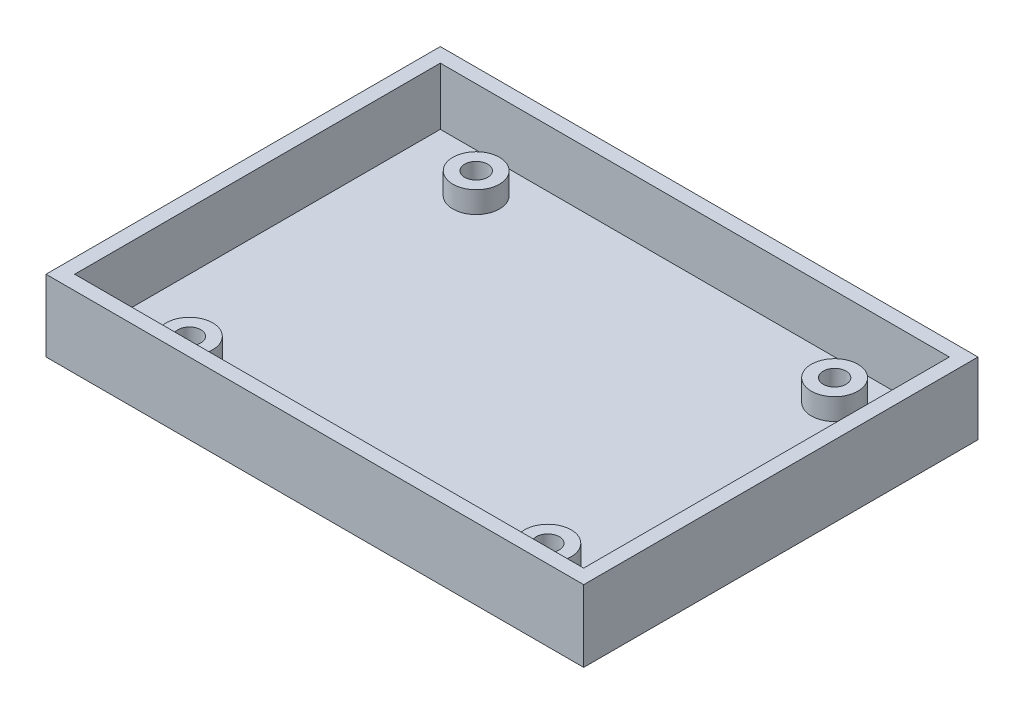
ISO-10303-21;
HEADER;
FILE_DESCRIPTION(('STEP AP214'),'2;1');
FILE_NAME('part.step','',(''),(''),'','','');
FILE_SCHEMA(('AUTOMOTIVE_DESIGN { 1 0 10303 214 1 1 1 1 }'));
ENDSEC;
DATA;
#1=APPLICATION_CONTEXT('core data for automotive mechanical design processes');
#2=APPLICATION_PROTOCOL_DEFINITION('international standard','automotive_design',2000,#1);
#3=PRODUCT_CONTEXT('',#1,'mechanical');
#4=PRODUCT('Part','Part','',(#3));
#5=PRODUCT_RELATED_PRODUCT_CATEGORY('part','',(#4));
#6=PRODUCT_DEFINITION_FORMATION('','',#4);
#7=PRODUCT_DEFINITION_CONTEXT('part definition',#1,'design');
#8=PRODUCT_DEFINITION('design','',#6,#7);
#9=PRODUCT_DEFINITION_SHAPE('','',#8);
#10=(LENGTH_UNIT() NAMED_UNIT(*) SI_UNIT(.MILLI.,.METRE.));
#11=(NAMED_UNIT(*) PLANE_ANGLE_UNIT() SI_UNIT($,.RADIAN.));
#12=(NAMED_UNIT(*) SI_UNIT($,.STERADIAN.) SOLID_ANGLE_UNIT());
#13=UNCERTAINTY_MEASURE_WITH_UNIT(LENGTH_MEASURE(1.E-05),#10,'distance_accuracy_value','');
#14=(GEOMETRIC_REPRESENTATION_CONTEXT(3) GLOBAL_UNCERTAINTY_ASSIGNED_CONTEXT((#13)) GLOBAL_UNIT_ASSIGNED_CONTEXT((#10,
#11,#12)) REPRESENTATION_CONTEXT('',''));
#15=CARTESIAN_POINT('',(0.,0.,0.));
#16=DIRECTION('',(0.,0.,1.));
#17=DIRECTION('',(1.,0.,0.));
#18=AXIS2_PLACEMENT_3D('',#15,#16,#17);
#19=CARTESIAN_POINT('',(-37.5,10.,27.5));
#20=DIRECTION('',(1.,0.,0.));
#21=DIRECTION('',(0.,0.,-1.));
#22=AXIS2_PLACEMENT_3D('',#19,#20,#21);
#23=PLANE('',#22);
#24=DIRECTION('',(0.,0.,1.));
#25=VECTOR('',#24,1.);
#26=CARTESIAN_POINT('',(-37.5,0.,27.5));
#27=LINE('',#26,#25);
#28=CARTESIAN_POINT('',(-37.5,0.,-27.5));
#29=VERTEX_POINT('',#28);
#30=CARTESIAN_POINT('',(-37.5,0.,27.5));
#31=VERTEX_POINT('',#30);
#32=EDGE_CURVE('E147',#29,#31,#27,.T.);
#33=ORIENTED_EDGE('',*,*,#32,.T.);
#34=DIRECTION('',(0.,-1.,0.));
#35=VECTOR('',#34,1.);
#36=CARTESIAN_POINT('',(-37.5,10.,27.5));
#37=LINE('',#36,#35);
#38=CARTESIAN_POINT('',(-37.5,10.,27.5));
#39=VERTEX_POINT('',#38);
#40=EDGE_CURVE('E11',#39,#31,#37,.T.);
#41=ORIENTED_EDGE('',*,*,#40,.F.);
#42=DIRECTION('',(0.,0.,1.));
#43=VECTOR('',#42,1.);
#44=CARTESIAN_POINT('',(-37.5,10.,27.5));
#45=LINE('',#44,#43);
#46=CARTESIAN_POINT('',(-37.5,10.,-27.5));
#47=VERTEX_POINT('',#46);
#48=EDGE_CURVE('E140',#47,#39,#45,.T.);
#49=ORIENTED_EDGE('',*,*,#48,.F.);
#50=DIRECTION('',(0.,-1.,0.));
#51=VECTOR('',#50,1.);
#52=CARTESIAN_POINT('',(-37.5,10.,-27.5));
#53=LINE('',#52,#51);
#54=EDGE_CURVE('E146',#47,#29,#53,.T.);
#55=ORIENTED_EDGE('',*,*,#54,.T.);
#56=EDGE_LOOP('',(#33,#41,#49,#55));
#57=FACE_BOUND('',#56,.T.);
#58=ADVANCED_FACE('F33',(#57),#23,.F.);
#59=CARTESIAN_POINT('',(37.5,10.,27.5));
#60=DIRECTION('',(0.,0.,-1.));
#61=DIRECTION('',(-1.,0.,0.));
#62=AXIS2_PLACEMENT_3D('',#59,#60,#61);
#63=PLANE('',#62);
#64=DIRECTION('',(1.,0.,0.));
#65=VECTOR('',#64,1.);
#66=CARTESIAN_POINT('',(37.5,0.,27.5));
#67=LINE('',#66,#65);
#68=CARTESIAN_POINT('',(37.5,0.,27.5));
#69=VERTEX_POINT('',#68);
#70=EDGE_CURVE('E150',#31,#69,#67,.T.);
#71=ORIENTED_EDGE('',*,*,#70,.T.);
#72=DIRECTION('',(0.,-1.,0.));
#73=VECTOR('',#72,1.);
#74=CARTESIAN_POINT('',(37.5,10.,27.5));
#75=LINE('',#74,#73);
#76=CARTESIAN_POINT('',(37.5,10.,27.5));
#77=VERTEX_POINT('',#76);
#78=EDGE_CURVE('E40',#77,#69,#75,.T.);
#79=ORIENTED_EDGE('',*,*,#78,.F.);
#80=DIRECTION('',(1.,0.,0.));
#81=VECTOR('',#80,1.);
#82=CARTESIAN_POINT('',(37.5,10.,27.5));
#83=LINE('',#82,#81);
#84=EDGE_CURVE('E84',#39,#77,#83,.T.);
#85=ORIENTED_EDGE('',*,*,#84,.F.);
#86=ORIENTED_EDGE('',*,*,#40,.T.);
#87=EDGE_LOOP('',(#71,#79,#85,#86));
#88=FACE_BOUND('',#87,.T.);
#89=ADVANCED_FACE('F179',(#88),#63,.F.);
#90=CARTESIAN_POINT('',(37.5,10.,27.5));
#91=DIRECTION('',(-1.,0.,0.));
#92=DIRECTION('',(0.,0.,1.));
#93=AXIS2_PLACEMENT_3D('',#90,#91,#92);
#94=PLANE('',#93);
#95=DIRECTION('',(0.,0.,-1.));
#96=VECTOR('',#95,1.);
#97=CARTESIAN_POINT('',(37.5,0.,27.5));
#98=LINE('',#97,#96);
#99=CARTESIAN_POINT('',(37.5,0.,-27.5));
#100=VERTEX_POINT('',#99);
#101=EDGE_CURVE('E152',#69,#100,#98,.T.);
#102=ORIENTED_EDGE('',*,*,#101,.T.);
#103=DIRECTION('',(0.,-1.,0.));
#104=VECTOR('',#103,1.);
#105=CARTESIAN_POINT('',(37.5,10.,-27.5));
#106=LINE('',#105,#104);
#107=CARTESIAN_POINT('',(37.5,10.,-27.5));
#108=VERTEX_POINT('',#107);
#109=EDGE_CURVE('E156',#108,#100,#106,.T.);
#110=ORIENTED_EDGE('',*,*,#109,.F.);
#111=DIRECTION('',(0.,0.,-1.));
#112=VECTOR('',#111,1.);
#113=CARTESIAN_POINT('',(37.5,10.,27.5));
#114=LINE('',#113,#112);
#115=EDGE_CURVE('E143',#77,#108,#114,.T.);
#116=ORIENTED_EDGE('',*,*,#115,.F.);
#117=ORIENTED_EDGE('',*,*,#78,.T.);
#118=EDGE_LOOP('',(#102,#110,#116,#117));
#119=FACE_BOUND('',#118,.T.);
#120=ADVANCED_FACE('F161',(#119),#94,.F.);
#121=CARTESIAN_POINT('',(37.5,10.,-27.5));
#122=DIRECTION('',(0.,0.,1.));
#123=DIRECTION('',(1.,0.,0.));
#124=AXIS2_PLACEMENT_3D('',#121,#122,#123);
#125=PLANE('',#124);
#126=DIRECTION('',(-1.,0.,0.));
#127=VECTOR('',#126,1.);
#128=CARTESIAN_POINT('',(37.5,0.,-27.5));
#129=LINE('',#128,#127);
#130=EDGE_CURVE('E77',#100,#29,#129,.T.);
#131=ORIENTED_EDGE('',*,*,#130,.T.);
#132=ORIENTED_EDGE('',*,*,#54,.F.);
#133=DIRECTION('',(-1.,0.,0.));
#134=VECTOR('',#133,1.);
#135=CARTESIAN_POINT('',(37.5,10.,-27.5));
#136=LINE('',#135,#134);
#137=EDGE_CURVE('E56',#108,#47,#136,.T.);
#138=ORIENTED_EDGE('',*,*,#137,.F.);
#139=ORIENTED_EDGE('',*,*,#109,.T.);
#140=EDGE_LOOP('',(#131,#132,#138,#139));
#141=FACE_BOUND('',#140,.T.);
#142=ADVANCED_FACE('F169',(#141),#125,.F.);
#143=CARTESIAN_POINT('',(0.,10.,0.));
#144=DIRECTION('',(0.,1.,0.));
#145=DIRECTION('',(0.,0.,1.));
#146=AXIS2_PLACEMENT_3D('',#143,#144,#145);
#147=PLANE('',#146);
#148=DIRECTION('',(0.,0.,1.));
#149=VECTOR('',#148,1.);
#150=CARTESIAN_POINT('',(-35.5,10.,27.5));
#151=LINE('',#150,#149);
#152=CARTESIAN_POINT('',(-35.5,10.,-25.5));
#153=VERTEX_POINT('',#152);
#154=CARTESIAN_POINT('',(-35.5,10.,25.5));
#155=VERTEX_POINT('',#154);
#156=EDGE_CURVE('E129',#153,#155,#151,.T.);
#157=ORIENTED_EDGE('',*,*,#156,.F.);
#158=DIRECTION('',(-1.,0.,0.));
#159=VECTOR('',#158,1.);
#160=CARTESIAN_POINT('',(37.5,10.,-25.5));
#161=LINE('',#160,#159);
#162=CARTESIAN_POINT('',(35.5,10.,-25.5));
#163=VERTEX_POINT('',#162);
#164=EDGE_CURVE('E138',#163,#153,#161,.T.);
#165=ORIENTED_EDGE('',*,*,#164,.F.);
#166=DIRECTION('',(0.,0.,-1.));
#167=VECTOR('',#166,1.);
#168=CARTESIAN_POINT('',(35.5,10.,27.5));
#169=LINE('',#168,#167);
#170=CARTESIAN_POINT('',(35.5,10.,25.5));
#171=VERTEX_POINT('',#170);
#172=EDGE_CURVE('E136',#171,#163,#169,.T.);
#173=ORIENTED_EDGE('',*,*,#172,.F.);
#174=DIRECTION('',(1.,0.,0.));
#175=VECTOR('',#174,1.);
#176=CARTESIAN_POINT('',(37.5,10.,25.5));
#177=LINE('',#176,#175);
#178=EDGE_CURVE('E121',#155,#171,#177,.T.);
#179=ORIENTED_EDGE('',*,*,#178,.F.);
#180=EDGE_LOOP('',(#157,#165,#173,#179));
#181=FACE_BOUND('',#180,.T.);
#182=ORIENTED_EDGE('',*,*,#48,.T.);
#183=ORIENTED_EDGE('',*,*,#84,.T.);
#184=ORIENTED_EDGE('',*,*,#115,.T.);
#185=ORIENTED_EDGE('',*,*,#137,.T.);
#186=EDGE_LOOP('',(#182,#183,#184,#185));
#187=FACE_BOUND('',#186,.T.);
#188=ADVANCED_FACE('F171',(#181,#187),#147,.T.);
#189=CARTESIAN_POINT('',(0.,0.,0.));
#190=DIRECTION('',(0.,1.,0.));
#191=DIRECTION('',(0.,0.,1.));
#192=AXIS2_PLACEMENT_3D('',#189,#190,#191);
#193=PLANE('',#192);
#194=ORIENTED_EDGE('',*,*,#32,.F.);
#195=ORIENTED_EDGE('',*,*,#130,.F.);
#196=ORIENTED_EDGE('',*,*,#101,.F.);
#197=ORIENTED_EDGE('',*,*,#70,.F.);
#198=EDGE_LOOP('',(#194,#195,#196,#197));
#199=FACE_BOUND('',#198,.T.);
#200=ADVANCED_FACE('F165',(#199),#193,.F.);
#201=CARTESIAN_POINT('',(-35.5,10.,27.5));
#202=DIRECTION('',(1.,0.,0.));
#203=DIRECTION('',(0.,0.,-1.));
#204=AXIS2_PLACEMENT_3D('',#201,#202,#203);
#205=PLANE('',#204);
#206=DIRECTION('',(0.,0.,1.));
#207=VECTOR('',#206,1.);
#208=CARTESIAN_POINT('',(-35.5,2.,27.5));
#209=LINE('',#208,#207);
#210=CARTESIAN_POINT('',(-35.5,2.,-25.5));
#211=VERTEX_POINT('',#210);
#212=CARTESIAN_POINT('',(-35.5,2.,25.5));
#213=VERTEX_POINT('',#212);
#214=EDGE_CURVE('E112',#211,#213,#209,.T.);
#215=ORIENTED_EDGE('',*,*,#214,.F.);
#216=DIRECTION('',(0.,-1.,0.));
#217=VECTOR('',#216,1.);
#218=CARTESIAN_POINT('',(-35.5,10.,-25.5));
#219=LINE('',#218,#217);
#220=EDGE_CURVE('E132',#153,#211,#219,.T.);
#221=ORIENTED_EDGE('',*,*,#220,.F.);
#222=ORIENTED_EDGE('',*,*,#156,.T.);
#223=DIRECTION('',(0.,-1.,0.));
#224=VECTOR('',#223,1.);
#225=CARTESIAN_POINT('',(-35.5,10.,25.5));
#226=LINE('',#225,#224);
#227=EDGE_CURVE('E124',#155,#213,#226,.T.);
#228=ORIENTED_EDGE('',*,*,#227,.T.);
#229=EDGE_LOOP('',(#215,#221,#222,#228));
#230=FACE_BOUND('',#229,.T.);
#231=ADVANCED_FACE('F206',(#230),#205,.T.);
#232=CARTESIAN_POINT('',(37.5,10.,25.5));
#233=DIRECTION('',(0.,0.,-1.));
#234=DIRECTION('',(-1.,0.,0.));
#235=AXIS2_PLACEMENT_3D('',#232,#233,#234);
#236=PLANE('',#235);
#237=DIRECTION('',(1.,0.,0.));
#238=VECTOR('',#237,1.);
#239=CARTESIAN_POINT('',(37.5,2.,25.5));
#240=LINE('',#239,#238);
#241=CARTESIAN_POINT('',(35.5,2.,25.5));
#242=VERTEX_POINT('',#241);
#243=EDGE_CURVE('E106',#213,#242,#240,.T.);
#244=ORIENTED_EDGE('',*,*,#243,.F.);
#245=ORIENTED_EDGE('',*,*,#227,.F.);
#246=ORIENTED_EDGE('',*,*,#178,.T.);
#247=DIRECTION('',(0.,-1.,0.));
#248=VECTOR('',#247,1.);
#249=CARTESIAN_POINT('',(35.5,10.,25.5));
#250=LINE('',#249,#248);
#251=EDGE_CURVE('E118',#171,#242,#250,.T.);
#252=ORIENTED_EDGE('',*,*,#251,.T.);
#253=EDGE_LOOP('',(#244,#245,#246,#252));
#254=FACE_BOUND('',#253,.T.);
#255=ADVANCED_FACE('F119',(#254),#236,.T.);
#256=CARTESIAN_POINT('',(35.5,10.,27.5));
#257=DIRECTION('',(-1.,0.,0.));
#258=DIRECTION('',(0.,0.,1.));
#259=AXIS2_PLACEMENT_3D('',#256,#257,#258);
#260=PLANE('',#259);
#261=DIRECTION('',(0.,0.,-1.));
#262=VECTOR('',#261,1.);
#263=CARTESIAN_POINT('',(35.5,2.,27.5));
#264=LINE('',#263,#262);
#265=CARTESIAN_POINT('',(35.5,2.,-25.5));
#266=VERTEX_POINT('',#265);
#267=EDGE_CURVE('E110',#242,#266,#264,.T.);
#268=ORIENTED_EDGE('',*,*,#267,.F.);
#269=ORIENTED_EDGE('',*,*,#251,.F.);
#270=ORIENTED_EDGE('',*,*,#172,.T.);
#271=DIRECTION('',(0.,-1.,0.));
#272=VECTOR('',#271,1.);
#273=CARTESIAN_POINT('',(35.5,10.,-25.5));
#274=LINE('',#273,#272);
#275=EDGE_CURVE('E47',#163,#266,#274,.T.);
#276=ORIENTED_EDGE('',*,*,#275,.T.);
#277=EDGE_LOOP('',(#268,#269,#270,#276));
#278=FACE_BOUND('',#277,.T.);
#279=ADVANCED_FACE('F126',(#278),#260,.T.);
#280=CARTESIAN_POINT('',(37.5,10.,-25.5));
#281=DIRECTION('',(0.,0.,1.));
#282=DIRECTION('',(1.,0.,0.));
#283=AXIS2_PLACEMENT_3D('',#280,#281,#282);
#284=PLANE('',#283);
#285=DIRECTION('',(-1.,0.,0.));
#286=VECTOR('',#285,1.);
#287=CARTESIAN_POINT('',(37.5,2.,-25.5));
#288=LINE('',#287,#286);
#289=EDGE_CURVE('E127',#266,#211,#288,.T.);
#290=ORIENTED_EDGE('',*,*,#289,.F.);
#291=ORIENTED_EDGE('',*,*,#275,.F.);
#292=ORIENTED_EDGE('',*,*,#164,.T.);
#293=ORIENTED_EDGE('',*,*,#220,.T.);
#294=EDGE_LOOP('',(#290,#291,#292,#293));
#295=FACE_BOUND('',#294,.T.);
#296=ADVANCED_FACE('F236',(#295),#284,.T.);
#297=CARTESIAN_POINT('',(0.,2.,0.));
#298=DIRECTION('',(0.,1.,0.));
#299=DIRECTION('',(0.,0.,1.));
#300=AXIS2_PLACEMENT_3D('',#297,#298,#299);
#301=PLANE('',#300);
#302=CARTESIAN_POINT('',(-25.,2.,20.));
#303=DIRECTION('',(0.,1.,0.));
#304=DIRECTION('',(0.,0.,1.));
#305=AXIS2_PLACEMENT_3D('',#302,#303,#304);
#306=CIRCLE('',#305,3.25);
#307=CARTESIAN_POINT('',(-25.,2.,23.25));
#308=VERTEX_POINT('',#307);
#309=EDGE_CURVE('E420',#308,#308,#306,.T.);
#310=ORIENTED_EDGE('',*,*,#309,.F.);
#311=EDGE_LOOP('',(#310));
#312=FACE_BOUND('',#311,.T.);
#313=CARTESIAN_POINT('',(25.,2.,20.));
#314=DIRECTION('',(0.,1.,0.));
#315=DIRECTION('',(0.,0.,1.));
#316=AXIS2_PLACEMENT_3D('',#313,#314,#315);
#317=CIRCLE('',#316,3.25);
#318=CARTESIAN_POINT('',(25.,2.,23.25));
#319=VERTEX_POINT('',#318);
#320=EDGE_CURVE('E434',#319,#319,#317,.T.);
#321=ORIENTED_EDGE('',*,*,#320,.F.);
#322=EDGE_LOOP('',(#321));
#323=FACE_BOUND('',#322,.T.);
#324=CARTESIAN_POINT('',(25.,2.,-20.));
#325=DIRECTION('',(0.,1.,0.));
#326=DIRECTION('',(0.,0.,1.));
#327=AXIS2_PLACEMENT_3D('',#324,#325,#326);
#328=CIRCLE('',#327,3.25);
#329=CARTESIAN_POINT('',(25.,2.,-16.75));
#330=VERTEX_POINT('',#329);
#331=EDGE_CURVE('E439',#330,#330,#328,.T.);
#332=ORIENTED_EDGE('',*,*,#331,.F.);
#333=EDGE_LOOP('',(#332));
#334=FACE_BOUND('',#333,.T.);
#335=CARTESIAN_POINT('',(-25.,2.,-20.));
#336=DIRECTION('',(0.,1.,0.));
#337=DIRECTION('',(0.,0.,1.));
#338=AXIS2_PLACEMENT_3D('',#335,#336,#337);
#339=CIRCLE('',#338,3.25);
#340=CARTESIAN_POINT('',(-25.,2.,-16.75));
#341=VERTEX_POINT('',#340);
#342=EDGE_CURVE('E445',#341,#341,#339,.T.);
#343=ORIENTED_EDGE('',*,*,#342,.F.);
#344=EDGE_LOOP('',(#343));
#345=FACE_BOUND('',#344,.T.);
#346=ORIENTED_EDGE('',*,*,#214,.T.);
#347=ORIENTED_EDGE('',*,*,#243,.T.);
#348=ORIENTED_EDGE('',*,*,#267,.T.);
#349=ORIENTED_EDGE('',*,*,#289,.T.);
#350=EDGE_LOOP('',(#346,#347,#348,#349));
#351=FACE_BOUND('',#350,.T.);
#352=ADVANCED_FACE('F108',(#312,#323,#334,#345,#351),#301,.T.);
#353=CARTESIAN_POINT('',(-25.,5.,-20.));
#354=DIRECTION('',(0.,-1.,0.));
#355=DIRECTION('',(0.,0.,-1.));
#356=AXIS2_PLACEMENT_3D('',#353,#354,#355);
#357=CYLINDRICAL_SURFACE('',#356,3.25);
#358=CARTESIAN_POINT('',(-25.,5.,-20.));
#359=DIRECTION('',(0.,1.,0.));
#360=DIRECTION('',(0.,0.,1.));
#361=AXIS2_PLACEMENT_3D('',#358,#359,#360);
#362=CIRCLE('',#361,3.25);
#363=CARTESIAN_POINT('',(-25.,5.,-16.75));
#364=VERTEX_POINT('',#363);
#365=EDGE_CURVE('E448',#364,#364,#362,.T.);
#366=ORIENTED_EDGE('',*,*,#365,.F.);
#367=EDGE_LOOP('',(#366));
#368=FACE_BOUND('',#367,.T.);
#369=ORIENTED_EDGE('',*,*,#342,.T.);
#370=EDGE_LOOP('',(#369));
#371=FACE_BOUND('',#370,.T.);
#372=ADVANCED_FACE('F253',(#368,#371),#357,.T.);
#373=CARTESIAN_POINT('',(-25.,5.,-20.));
#374=DIRECTION('',(0.,1.,0.));
#375=DIRECTION('',(0.,0.,1.));
#376=AXIS2_PLACEMENT_3D('',#373,#374,#375);
#377=PLANE('',#376);
#378=CARTESIAN_POINT('',(-25.,5.,-20.));
#379=DIRECTION('',(0.,1.,0.));
#380=DIRECTION('',(0.,0.,1.));
#381=AXIS2_PLACEMENT_3D('',#378,#379,#380);
#382=CIRCLE('',#381,1.6);
#383=CARTESIAN_POINT('',(-25.,5.,-18.4));
#384=VERTEX_POINT('',#383);
#385=EDGE_CURVE('E421',#384,#384,#382,.T.);
#386=ORIENTED_EDGE('',*,*,#385,.F.);
#387=EDGE_LOOP('',(#386));
#388=FACE_BOUND('',#387,.T.);
#389=ORIENTED_EDGE('',*,*,#365,.T.);
#390=EDGE_LOOP('',(#389));
#391=FACE_BOUND('',#390,.T.);
#392=ADVANCED_FACE('F263',(#388,#391),#377,.T.);
#393=CARTESIAN_POINT('',(25.,5.,-20.));
#394=DIRECTION('',(0.,-1.,0.));
#395=DIRECTION('',(0.,0.,-1.));
#396=AXIS2_PLACEMENT_3D('',#393,#394,#395);
#397=CYLINDRICAL_SURFACE('',#396,3.25);
#398=CARTESIAN_POINT('',(25.,5.,-20.));
#399=DIRECTION('',(0.,1.,0.));
#400=DIRECTION('',(0.,0.,1.));
#401=AXIS2_PLACEMENT_3D('',#398,#399,#400);
#402=CIRCLE('',#401,3.25);
#403=CARTESIAN_POINT('',(25.,5.,-16.75));
#404=VERTEX_POINT('',#403);
#405=EDGE_CURVE('E442',#404,#404,#402,.T.);
#406=ORIENTED_EDGE('',*,*,#405,.F.);
#407=EDGE_LOOP('',(#406));
#408=FACE_BOUND('',#407,.T.);
#409=ORIENTED_EDGE('',*,*,#331,.T.);
#410=EDGE_LOOP('',(#409));
#411=FACE_BOUND('',#410,.T.);
#412=ADVANCED_FACE('F271',(#408,#411),#397,.T.);
#413=CARTESIAN_POINT('',(25.,5.,-20.));
#414=DIRECTION('',(0.,1.,0.));
#415=DIRECTION('',(0.,0.,1.));
#416=AXIS2_PLACEMENT_3D('',#413,#414,#415);
#417=PLANE('',#416);
#418=CARTESIAN_POINT('',(25.,5.,-20.));
#419=DIRECTION('',(0.,1.,0.));
#420=DIRECTION('',(0.,0.,1.));
#421=AXIS2_PLACEMENT_3D('',#418,#419,#420);
#422=CIRCLE('',#421,1.6);
#423=CARTESIAN_POINT('',(25.,5.,-18.4));
#424=VERTEX_POINT('',#423);
#425=EDGE_CURVE('E488',#424,#424,#422,.T.);
#426=ORIENTED_EDGE('',*,*,#425,.F.);
#427=EDGE_LOOP('',(#426));
#428=FACE_BOUND('',#427,.T.);
#429=ORIENTED_EDGE('',*,*,#405,.T.);
#430=EDGE_LOOP('',(#429));
#431=FACE_BOUND('',#430,.T.);
#432=ADVANCED_FACE('F276',(#428,#431),#417,.T.);
#433=CARTESIAN_POINT('',(25.,5.,20.));
#434=DIRECTION('',(0.,-1.,0.));
#435=DIRECTION('',(0.,0.,-1.));
#436=AXIS2_PLACEMENT_3D('',#433,#434,#435);
#437=CYLINDRICAL_SURFACE('',#436,3.25);
#438=CARTESIAN_POINT('',(25.,5.,20.));
#439=DIRECTION('',(0.,1.,0.));
#440=DIRECTION('',(0.,0.,1.));
#441=AXIS2_PLACEMENT_3D('',#438,#439,#440);
#442=CIRCLE('',#441,3.25);
#443=CARTESIAN_POINT('',(25.,5.,23.25));
#444=VERTEX_POINT('',#443);
#445=EDGE_CURVE('E436',#444,#444,#442,.T.);
#446=ORIENTED_EDGE('',*,*,#445,.F.);
#447=EDGE_LOOP('',(#446));
#448=FACE_BOUND('',#447,.T.);
#449=ORIENTED_EDGE('',*,*,#320,.T.);
#450=EDGE_LOOP('',(#449));
#451=FACE_BOUND('',#450,.T.);
#452=ADVANCED_FACE('F284',(#448,#451),#437,.T.);
#453=CARTESIAN_POINT('',(25.,5.,20.));
#454=DIRECTION('',(0.,1.,0.));
#455=DIRECTION('',(0.,0.,1.));
#456=AXIS2_PLACEMENT_3D('',#453,#454,#455);
#457=PLANE('',#456);
#458=CARTESIAN_POINT('',(25.,5.,20.));
#459=DIRECTION('',(0.,1.,0.));
#460=DIRECTION('',(0.,0.,1.));
#461=AXIS2_PLACEMENT_3D('',#458,#459,#460);
#462=CIRCLE('',#461,1.6);
#463=CARTESIAN_POINT('',(25.,5.,21.6));
#464=VERTEX_POINT('',#463);
#465=EDGE_CURVE('E482',#464,#464,#462,.T.);
#466=ORIENTED_EDGE('',*,*,#465,.F.);
#467=EDGE_LOOP('',(#466));
#468=FACE_BOUND('',#467,.T.);
#469=ORIENTED_EDGE('',*,*,#445,.T.);
#470=EDGE_LOOP('',(#469));
#471=FACE_BOUND('',#470,.T.);
#472=ADVANCED_FACE('F289',(#468,#471),#457,.T.);
#473=CARTESIAN_POINT('',(-25.,5.,20.));
#474=DIRECTION('',(0.,-1.,0.));
#475=DIRECTION('',(0.,0.,-1.));
#476=AXIS2_PLACEMENT_3D('',#473,#474,#475);
#477=CYLINDRICAL_SURFACE('',#476,3.25);
#478=CARTESIAN_POINT('',(-25.,5.,20.));
#479=DIRECTION('',(0.,1.,0.));
#480=DIRECTION('',(0.,0.,1.));
#481=AXIS2_PLACEMENT_3D('',#478,#479,#480);
#482=CIRCLE('',#481,3.25);
#483=CARTESIAN_POINT('',(-25.,5.,23.25));
#484=VERTEX_POINT('',#483);
#485=EDGE_CURVE('E424',#484,#484,#482,.T.);
#486=ORIENTED_EDGE('',*,*,#485,.F.);
#487=EDGE_LOOP('',(#486));
#488=FACE_BOUND('',#487,.T.);
#489=ORIENTED_EDGE('',*,*,#309,.T.);
#490=EDGE_LOOP('',(#489));
#491=FACE_BOUND('',#490,.T.);
#492=ADVANCED_FACE('F297',(#488,#491),#477,.T.);
#493=CARTESIAN_POINT('',(-25.,5.,20.));
#494=DIRECTION('',(0.,1.,0.));
#495=DIRECTION('',(0.,0.,1.));
#496=AXIS2_PLACEMENT_3D('',#493,#494,#495);
#497=PLANE('',#496);
#498=CARTESIAN_POINT('',(-25.,5.,20.));
#499=DIRECTION('',(0.,1.,0.));
#500=DIRECTION('',(0.,0.,1.));
#501=AXIS2_PLACEMENT_3D('',#498,#499,#500);
#502=CIRCLE('',#501,1.6);
#503=CARTESIAN_POINT('',(-25.,5.,21.6));
#504=VERTEX_POINT('',#503);
#505=EDGE_CURVE('E430',#504,#504,#502,.T.);
#506=ORIENTED_EDGE('',*,*,#505,.F.);
#507=EDGE_LOOP('',(#506));
#508=FACE_BOUND('',#507,.T.);
#509=ORIENTED_EDGE('',*,*,#485,.T.);
#510=EDGE_LOOP('',(#509));
#511=FACE_BOUND('',#510,.T.);
#512=ADVANCED_FACE('F302',(#508,#511),#497,.T.);
#513=CARTESIAN_POINT('',(-25.,1.,20.));
#514=DIRECTION('',(0.,1.,0.));
#515=DIRECTION('',(0.,0.,1.));
#516=AXIS2_PLACEMENT_3D('',#513,#514,#515);
#517=CYLINDRICAL_SURFACE('',#516,1.6);
#518=CARTESIAN_POINT('',(-25.,1.,20.));
#519=DIRECTION('',(0.,1.,0.));
#520=DIRECTION('',(0.,0.,1.));
#521=AXIS2_PLACEMENT_3D('',#518,#519,#520);
#522=CIRCLE('',#521,1.6);
#523=CARTESIAN_POINT('',(-25.,1.,21.6));
#524=VERTEX_POINT('',#523);
#525=EDGE_CURVE('E479',#524,#524,#522,.T.);
#526=ORIENTED_EDGE('',*,*,#525,.F.);
#527=EDGE_LOOP('',(#526));
#528=FACE_BOUND('',#527,.T.);
#529=ORIENTED_EDGE('',*,*,#505,.T.);
#530=EDGE_LOOP('',(#529));
#531=FACE_BOUND('',#530,.T.);
#532=ADVANCED_FACE('F333',(#528,#531),#517,.F.);
#533=CARTESIAN_POINT('',(-25.,1.,20.));
#534=DIRECTION('',(0.,1.,0.));
#535=DIRECTION('',(0.,0.,1.));
#536=AXIS2_PLACEMENT_3D('',#533,#534,#535);
#537=PLANE('',#536);
#538=ORIENTED_EDGE('',*,*,#525,.T.);
#539=EDGE_LOOP('',(#538));
#540=FACE_BOUND('',#539,.T.);
#541=ADVANCED_FACE('F343',(#540),#537,.T.);
#542=CARTESIAN_POINT('',(25.,1.,20.));
#543=DIRECTION('',(0.,1.,0.));
#544=DIRECTION('',(0.,0.,1.));
#545=AXIS2_PLACEMENT_3D('',#542,#543,#544);
#546=CYLINDRICAL_SURFACE('',#545,1.6);
#547=CARTESIAN_POINT('',(25.,1.,20.));
#548=DIRECTION('',(0.,1.,0.));
#549=DIRECTION('',(0.,0.,1.));
#550=AXIS2_PLACEMENT_3D('',#547,#548,#549);
#551=CIRCLE('',#550,1.6);
#552=CARTESIAN_POINT('',(25.,1.,21.6));
#553=VERTEX_POINT('',#552);
#554=EDGE_CURVE('E485',#553,#553,#551,.T.);
#555=ORIENTED_EDGE('',*,*,#554,.F.);
#556=EDGE_LOOP('',(#555));
#557=FACE_BOUND('',#556,.T.);
#558=ORIENTED_EDGE('',*,*,#465,.T.);
#559=EDGE_LOOP('',(#558));
#560=FACE_BOUND('',#559,.T.);
#561=ADVANCED_FACE('F353',(#557,#560),#546,.F.);
#562=CARTESIAN_POINT('',(25.,1.,20.));
#563=DIRECTION('',(0.,1.,0.));
#564=DIRECTION('',(0.,0.,1.));
#565=AXIS2_PLACEMENT_3D('',#562,#563,#564);
#566=PLANE('',#565);
#567=ORIENTED_EDGE('',*,*,#554,.T.);
#568=EDGE_LOOP('',(#567));
#569=FACE_BOUND('',#568,.T.);
#570=ADVANCED_FACE('F363',(#569),#566,.T.);
#571=CARTESIAN_POINT('',(25.,1.,-20.));
#572=DIRECTION('',(0.,1.,0.));
#573=DIRECTION('',(0.,0.,1.));
#574=AXIS2_PLACEMENT_3D('',#571,#572,#573);
#575=CYLINDRICAL_SURFACE('',#574,1.6);
#576=CARTESIAN_POINT('',(25.,1.,-20.));
#577=DIRECTION('',(0.,1.,0.));
#578=DIRECTION('',(0.,0.,1.));
#579=AXIS2_PLACEMENT_3D('',#576,#577,#578);
#580=CIRCLE('',#579,1.6);
#581=CARTESIAN_POINT('',(25.,1.,-18.4));
#582=VERTEX_POINT('',#581);
#583=EDGE_CURVE('E427',#582,#582,#580,.T.);
#584=ORIENTED_EDGE('',*,*,#583,.F.);
#585=EDGE_LOOP('',(#584));
#586=FACE_BOUND('',#585,.T.);
#587=ORIENTED_EDGE('',*,*,#425,.T.);
#588=EDGE_LOOP('',(#587));
#589=FACE_BOUND('',#588,.T.);
#590=ADVANCED_FACE('F373',(#586,#589),#575,.F.);
#591=CARTESIAN_POINT('',(25.,1.,-20.));
#592=DIRECTION('',(0.,1.,0.));
#593=DIRECTION('',(0.,0.,1.));
#594=AXIS2_PLACEMENT_3D('',#591,#592,#593);
#595=PLANE('',#594);
#596=ORIENTED_EDGE('',*,*,#583,.T.);
#597=EDGE_LOOP('',(#596));
#598=FACE_BOUND('',#597,.T.);
#599=ADVANCED_FACE('F383',(#598),#595,.T.);
#600=CARTESIAN_POINT('',(-25.,1.,-20.));
#601=DIRECTION('',(0.,1.,0.));
#602=DIRECTION('',(0.,0.,1.));
#603=AXIS2_PLACEMENT_3D('',#600,#601,#602);
#604=CYLINDRICAL_SURFACE('',#603,1.6);
#605=CARTESIAN_POINT('',(-25.,1.,-20.));
#606=DIRECTION('',(0.,1.,0.));
#607=DIRECTION('',(0.,0.,1.));
#608=AXIS2_PLACEMENT_3D('',#605,#606,#607);
#609=CIRCLE('',#608,1.6);
#610=CARTESIAN_POINT('',(-25.,1.,-18.4));
#611=VERTEX_POINT('',#610);
#612=EDGE_CURVE('E419',#611,#611,#609,.T.);
#613=ORIENTED_EDGE('',*,*,#612,.F.);
#614=EDGE_LOOP('',(#613));
#615=FACE_BOUND('',#614,.T.);
#616=ORIENTED_EDGE('',*,*,#385,.T.);
#617=EDGE_LOOP('',(#616));
#618=FACE_BOUND('',#617,.T.);
#619=ADVANCED_FACE('F393',(#615,#618),#604,.F.);
#620=CARTESIAN_POINT('',(-25.,1.,-20.));
#621=DIRECTION('',(0.,1.,0.));
#622=DIRECTION('',(0.,0.,1.));
#623=AXIS2_PLACEMENT_3D('',#620,#621,#622);
#624=PLANE('',#623);
#625=ORIENTED_EDGE('',*,*,#612,.T.);
#626=EDGE_LOOP('',(#625));
#627=FACE_BOUND('',#626,.T.);
#628=ADVANCED_FACE('F403',(#627),#624,.T.);
#629=CLOSED_SHELL('',(#58,#89,#120,#142,#188,#200,#231,#255,#279,#296,#352,#372,#392,#412,#432,
#452,#472,#492,#512,#532,#541,#561,#570,#590,#599,#619,#628));
#630=MANIFOLD_SOLID_BREP('B2',#629);
#631=ADVANCED_BREP_SHAPE_REPRESENTATION('',(#18,#630),#14);
#632=SHAPE_DEFINITION_REPRESENTATION(#9,#631);
ENDSEC;
END-ISO-10303-21;
